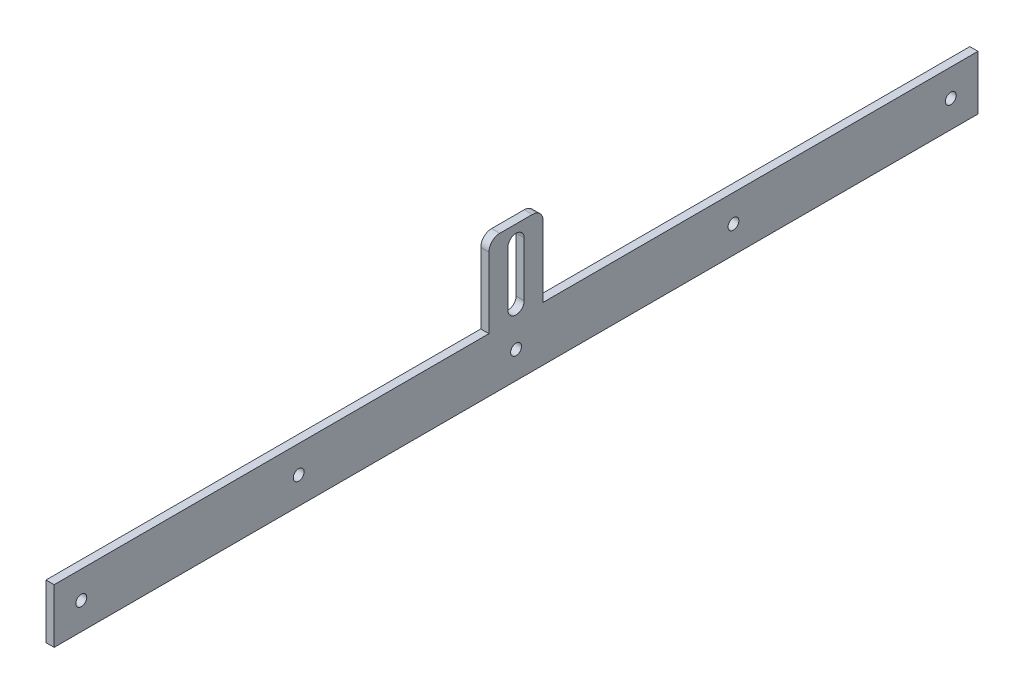
ISO-10303-21;
HEADER;
FILE_DESCRIPTION(('STEP AP214'),'2;1');
FILE_NAME('part.step','',(''),(''),'','','');
FILE_SCHEMA(('AUTOMOTIVE_DESIGN { 1 0 10303 214 1 1 1 1 }'));
ENDSEC;
DATA;
#1=APPLICATION_CONTEXT('core data for automotive mechanical design processes');
#2=APPLICATION_PROTOCOL_DEFINITION('international standard','automotive_design',2000,#1);
#3=PRODUCT_CONTEXT('',#1,'mechanical');
#4=PRODUCT('Part','Part','',(#3));
#5=PRODUCT_RELATED_PRODUCT_CATEGORY('part','',(#4));
#6=PRODUCT_DEFINITION_FORMATION('','',#4);
#7=PRODUCT_DEFINITION_CONTEXT('part definition',#1,'design');
#8=PRODUCT_DEFINITION('design','',#6,#7);
#9=PRODUCT_DEFINITION_SHAPE('','',#8);
#10=(LENGTH_UNIT() NAMED_UNIT(*) SI_UNIT(.MILLI.,.METRE.));
#11=(NAMED_UNIT(*) PLANE_ANGLE_UNIT() SI_UNIT($,.RADIAN.));
#12=(NAMED_UNIT(*) SI_UNIT($,.STERADIAN.) SOLID_ANGLE_UNIT());
#13=UNCERTAINTY_MEASURE_WITH_UNIT(LENGTH_MEASURE(1.E-05),#10,'distance_accuracy_value','');
#14=(GEOMETRIC_REPRESENTATION_CONTEXT(3) GLOBAL_UNCERTAINTY_ASSIGNED_CONTEXT((#13)) GLOBAL_UNIT_ASSIGNED_CONTEXT((#10,
#11,#12)) REPRESENTATION_CONTEXT('',''));
#15=CARTESIAN_POINT('',(0.,0.,0.));
#16=DIRECTION('',(0.,0.,1.));
#17=DIRECTION('',(1.,0.,0.));
#18=AXIS2_PLACEMENT_3D('',#15,#16,#17);
#19=CARTESIAN_POINT('',(3.,20.,0.));
#20=DIRECTION('',(0.,-1.,0.));
#21=DIRECTION('',(0.,0.,-1.));
#22=AXIS2_PLACEMENT_3D('',#19,#20,#21);
#23=PLANE('',#22);
#24=DIRECTION('',(1.,0.,0.));
#25=VECTOR('',#24,1.);
#26=CARTESIAN_POINT('',(0.,20.,-160.));
#27=LINE('',#26,#25);
#28=CARTESIAN_POINT('',(0.,20.,-160.));
#29=VERTEX_POINT('',#28);
#30=CARTESIAN_POINT('',(3.,20.,-160.));
#31=VERTEX_POINT('',#30);
#32=EDGE_CURVE('E214',#29,#31,#27,.T.);
#33=ORIENTED_EDGE('',*,*,#32,.F.);
#34=DIRECTION('',(0.,0.,1.));
#35=VECTOR('',#34,1.);
#36=CARTESIAN_POINT('',(0.,20.,0.));
#37=LINE('',#36,#35);
#38=CARTESIAN_POINT('',(0.,20.,0.));
#39=VERTEX_POINT('',#38);
#40=EDGE_CURVE('E82',#29,#39,#37,.T.);
#41=ORIENTED_EDGE('',*,*,#40,.T.);
#42=DIRECTION('',(-1.,0.,0.));
#43=VECTOR('',#42,1.);
#44=CARTESIAN_POINT('',(3.,20.,0.));
#45=LINE('',#44,#43);
#46=CARTESIAN_POINT('',(3.,20.,0.));
#47=VERTEX_POINT('',#46);
#48=EDGE_CURVE('E278',#47,#39,#45,.T.);
#49=ORIENTED_EDGE('',*,*,#48,.F.);
#50=DIRECTION('',(0.,0.,1.));
#51=VECTOR('',#50,1.);
#52=CARTESIAN_POINT('',(3.,20.,0.));
#53=LINE('',#52,#51);
#54=EDGE_CURVE('E60',#31,#47,#53,.T.);
#55=ORIENTED_EDGE('',*,*,#54,.F.);
#56=EDGE_LOOP('',(#33,#41,#49,#55));
#57=FACE_BOUND('',#56,.T.);
#58=ADVANCED_FACE('F34',(#57),#23,.F.);
#59=CARTESIAN_POINT('',(3.,0.,0.));
#60=DIRECTION('',(0.,0.,-1.));
#61=DIRECTION('',(-1.,0.,0.));
#62=AXIS2_PLACEMENT_3D('',#59,#60,#61);
#63=PLANE('',#62);
#64=DIRECTION('',(0.,-1.,0.));
#65=VECTOR('',#64,1.);
#66=CARTESIAN_POINT('',(0.,0.,0.));
#67=LINE('',#66,#65);
#68=CARTESIAN_POINT('',(0.,0.,0.));
#69=VERTEX_POINT('',#68);
#70=EDGE_CURVE('E270',#39,#69,#67,.T.);
#71=ORIENTED_EDGE('',*,*,#70,.T.);
#72=DIRECTION('',(-1.,0.,0.));
#73=VECTOR('',#72,1.);
#74=CARTESIAN_POINT('',(3.,0.,0.));
#75=LINE('',#74,#73);
#76=CARTESIAN_POINT('',(3.,0.,0.));
#77=VERTEX_POINT('',#76);
#78=EDGE_CURVE('E11',#77,#69,#75,.T.);
#79=ORIENTED_EDGE('',*,*,#78,.F.);
#80=DIRECTION('',(0.,-1.,0.));
#81=VECTOR('',#80,1.);
#82=CARTESIAN_POINT('',(3.,0.,0.));
#83=LINE('',#82,#81);
#84=EDGE_CURVE('E262',#47,#77,#83,.T.);
#85=ORIENTED_EDGE('',*,*,#84,.F.);
#86=ORIENTED_EDGE('',*,*,#48,.T.);
#87=EDGE_LOOP('',(#71,#79,#85,#86));
#88=FACE_BOUND('',#87,.T.);
#89=ADVANCED_FACE('F36',(#88),#63,.F.);
#90=CARTESIAN_POINT('',(3.,0.,0.));
#91=DIRECTION('',(0.,1.,0.));
#92=DIRECTION('',(0.,0.,1.));
#93=AXIS2_PLACEMENT_3D('',#90,#91,#92);
#94=PLANE('',#93);
#95=DIRECTION('',(0.,0.,-1.));
#96=VECTOR('',#95,1.);
#97=CARTESIAN_POINT('',(0.,0.,0.));
#98=LINE('',#97,#96);
#99=CARTESIAN_POINT('',(0.,0.,-340.));
#100=VERTEX_POINT('',#99);
#101=EDGE_CURVE('E322',#69,#100,#98,.T.);
#102=ORIENTED_EDGE('',*,*,#101,.T.);
#103=DIRECTION('',(-1.,0.,0.));
#104=VECTOR('',#103,1.);
#105=CARTESIAN_POINT('',(3.,0.,-340.));
#106=LINE('',#105,#104);
#107=CARTESIAN_POINT('',(3.,0.,-340.));
#108=VERTEX_POINT('',#107);
#109=EDGE_CURVE('E43',#108,#100,#106,.T.);
#110=ORIENTED_EDGE('',*,*,#109,.F.);
#111=DIRECTION('',(0.,0.,-1.));
#112=VECTOR('',#111,1.);
#113=CARTESIAN_POINT('',(3.,0.,0.));
#114=LINE('',#113,#112);
#115=EDGE_CURVE('E89',#77,#108,#114,.T.);
#116=ORIENTED_EDGE('',*,*,#115,.F.);
#117=ORIENTED_EDGE('',*,*,#78,.T.);
#118=EDGE_LOOP('',(#102,#110,#116,#117));
#119=FACE_BOUND('',#118,.T.);
#120=ADVANCED_FACE('F340',(#119),#94,.F.);
#121=CARTESIAN_POINT('',(3.,0.,-340.));
#122=DIRECTION('',(0.,0.,1.));
#123=DIRECTION('',(1.,0.,0.));
#124=AXIS2_PLACEMENT_3D('',#121,#122,#123);
#125=PLANE('',#124);
#126=DIRECTION('',(0.,1.,0.));
#127=VECTOR('',#126,1.);
#128=CARTESIAN_POINT('',(0.,0.,-340.));
#129=LINE('',#128,#127);
#130=CARTESIAN_POINT('',(0.,20.,-340.));
#131=VERTEX_POINT('',#130);
#132=EDGE_CURVE('E281',#100,#131,#129,.T.);
#133=ORIENTED_EDGE('',*,*,#132,.T.);
#134=DIRECTION('',(-1.,0.,0.));
#135=VECTOR('',#134,1.);
#136=CARTESIAN_POINT('',(3.,20.,-340.));
#137=LINE('',#136,#135);
#138=CARTESIAN_POINT('',(3.,20.,-340.));
#139=VERTEX_POINT('',#138);
#140=EDGE_CURVE('E288',#139,#131,#137,.T.);
#141=ORIENTED_EDGE('',*,*,#140,.F.);
#142=DIRECTION('',(0.,1.,0.));
#143=VECTOR('',#142,1.);
#144=CARTESIAN_POINT('',(3.,0.,-340.));
#145=LINE('',#144,#143);
#146=EDGE_CURVE('E266',#108,#139,#145,.T.);
#147=ORIENTED_EDGE('',*,*,#146,.F.);
#148=ORIENTED_EDGE('',*,*,#109,.T.);
#149=EDGE_LOOP('',(#133,#141,#147,#148));
#150=FACE_BOUND('',#149,.T.);
#151=ADVANCED_FACE('F327',(#150),#125,.F.);
#152=CARTESIAN_POINT('',(0.,20.,-180.));
#153=VERTEX_POINT('',#152);
#154=EDGE_CURVE('E264',#131,#153,#37,.T.);
#155=ORIENTED_EDGE('',*,*,#154,.T.);
#156=DIRECTION('',(1.,0.,0.));
#157=VECTOR('',#156,1.);
#158=CARTESIAN_POINT('',(0.,20.,-180.));
#159=LINE('',#158,#157);
#160=CARTESIAN_POINT('',(3.,20.,-180.));
#161=VERTEX_POINT('',#160);
#162=EDGE_CURVE('E210',#153,#161,#159,.T.);
#163=ORIENTED_EDGE('',*,*,#162,.T.);
#164=EDGE_CURVE('E275',#139,#161,#53,.T.);
#165=ORIENTED_EDGE('',*,*,#164,.F.);
#166=ORIENTED_EDGE('',*,*,#140,.T.);
#167=EDGE_LOOP('',(#155,#163,#165,#166));
#168=FACE_BOUND('',#167,.T.);
#169=ADVANCED_FACE('F333',(#168),#23,.F.);
#170=CARTESIAN_POINT('',(3.,0.,0.));
#171=DIRECTION('',(-1.,0.,0.));
#172=DIRECTION('',(0.,0.,1.));
#173=AXIS2_PLACEMENT_3D('',#170,#171,#172);
#174=PLANE('',#173);
#175=CARTESIAN_POINT('',(3.,10.,-330.));
#176=DIRECTION('',(1.,0.,0.));
#177=DIRECTION('',(0.,0.,-1.));
#178=AXIS2_PLACEMENT_3D('',#175,#176,#177);
#179=CIRCLE('',#178,2.);
#180=CARTESIAN_POINT('',(3.,10.,-332.));
#181=VERTEX_POINT('',#180);
#182=EDGE_CURVE('E213',#181,#181,#179,.T.);
#183=ORIENTED_EDGE('',*,*,#182,.F.);
#184=EDGE_LOOP('',(#183));
#185=FACE_BOUND('',#184,.T.);
#186=CARTESIAN_POINT('',(3.,10.,-250.));
#187=DIRECTION('',(1.,0.,0.));
#188=DIRECTION('',(0.,0.,-1.));
#189=AXIS2_PLACEMENT_3D('',#186,#187,#188);
#190=CIRCLE('',#189,2.);
#191=CARTESIAN_POINT('',(3.,10.,-252.));
#192=VERTEX_POINT('',#191);
#193=EDGE_CURVE('E246',#192,#192,#190,.T.);
#194=ORIENTED_EDGE('',*,*,#193,.F.);
#195=EDGE_LOOP('',(#194));
#196=FACE_BOUND('',#195,.T.);
#197=CARTESIAN_POINT('',(3.,10.,-170.));
#198=DIRECTION('',(1.,0.,0.));
#199=DIRECTION('',(0.,0.,-1.));
#200=AXIS2_PLACEMENT_3D('',#197,#198,#199);
#201=CIRCLE('',#200,2.);
#202=CARTESIAN_POINT('',(3.,10.,-172.));
#203=VERTEX_POINT('',#202);
#204=EDGE_CURVE('E250',#203,#203,#201,.T.);
#205=ORIENTED_EDGE('',*,*,#204,.F.);
#206=EDGE_LOOP('',(#205));
#207=FACE_BOUND('',#206,.T.);
#208=CARTESIAN_POINT('',(3.,10.,-90.));
#209=DIRECTION('',(1.,0.,0.));
#210=DIRECTION('',(0.,0.,-1.));
#211=AXIS2_PLACEMENT_3D('',#208,#209,#210);
#212=CIRCLE('',#211,2.00000000000001);
#213=CARTESIAN_POINT('',(3.,10.,-92.));
#214=VERTEX_POINT('',#213);
#215=EDGE_CURVE('E254',#214,#214,#212,.T.);
#216=ORIENTED_EDGE('',*,*,#215,.F.);
#217=EDGE_LOOP('',(#216));
#218=FACE_BOUND('',#217,.T.);
#219=CARTESIAN_POINT('',(3.,10.,-10.));
#220=DIRECTION('',(1.,0.,0.));
#221=DIRECTION('',(0.,0.,-1.));
#222=AXIS2_PLACEMENT_3D('',#219,#220,#221);
#223=CIRCLE('',#222,2.);
#224=CARTESIAN_POINT('',(3.,10.,-12.));
#225=VERTEX_POINT('',#224);
#226=EDGE_CURVE('E258',#225,#225,#223,.T.);
#227=ORIENTED_EDGE('',*,*,#226,.F.);
#228=EDGE_LOOP('',(#227));
#229=FACE_BOUND('',#228,.T.);
#230=ORIENTED_EDGE('',*,*,#84,.T.);
#231=ORIENTED_EDGE('',*,*,#115,.T.);
#232=ORIENTED_EDGE('',*,*,#146,.T.);
#233=ORIENTED_EDGE('',*,*,#164,.T.);
#234=DIRECTION('',(0.,1.,0.));
#235=VECTOR('',#234,1.);
#236=CARTESIAN_POINT('',(3.,1.92153985031277E-13,-180.));
#237=LINE('',#236,#235);
#238=CARTESIAN_POINT('',(3.,46.,-180.));
#239=VERTEX_POINT('',#238);
#240=EDGE_CURVE('E51',#161,#239,#237,.T.);
#241=ORIENTED_EDGE('',*,*,#240,.T.);
#242=CARTESIAN_POINT('',(3.,46.,-176.));
#243=DIRECTION('',(1.,0.,0.));
#244=DIRECTION('',(0.,0.,-1.));
#245=AXIS2_PLACEMENT_3D('',#242,#243,#244);
#246=CIRCLE('',#245,4.);
#247=CARTESIAN_POINT('',(3.,50.,-176.));
#248=VERTEX_POINT('',#247);
#249=EDGE_CURVE('E197',#239,#248,#246,.T.);
#250=ORIENTED_EDGE('',*,*,#249,.T.);
#251=DIRECTION('',(0.,0.,-1.));
#252=VECTOR('',#251,1.);
#253=CARTESIAN_POINT('',(3.,50.,0.));
#254=LINE('',#253,#252);
#255=CARTESIAN_POINT('',(3.,50.,-164.));
#256=VERTEX_POINT('',#255);
#257=EDGE_CURVE('E200',#256,#248,#254,.T.);
#258=ORIENTED_EDGE('',*,*,#257,.F.);
#259=CARTESIAN_POINT('',(3.,46.,-164.));
#260=DIRECTION('',(1.,0.,0.));
#261=DIRECTION('',(0.,0.,-1.));
#262=AXIS2_PLACEMENT_3D('',#259,#260,#261);
#263=CIRCLE('',#262,4.);
#264=CARTESIAN_POINT('',(3.,46.,-160.));
#265=VERTEX_POINT('',#264);
#266=EDGE_CURVE('E175',#265,#256,#263,.F.);
#267=ORIENTED_EDGE('',*,*,#266,.F.);
#268=DIRECTION('',(0.,1.,0.));
#269=VECTOR('',#268,1.);
#270=CARTESIAN_POINT('',(3.,0.,-160.));
#271=LINE('',#270,#269);
#272=EDGE_CURVE('E172',#31,#265,#271,.T.);
#273=ORIENTED_EDGE('',*,*,#272,.F.);
#274=ORIENTED_EDGE('',*,*,#54,.T.);
#275=EDGE_LOOP('',(#230,#231,#232,#233,#241,#250,#258,#267,#273,#274));
#276=FACE_BOUND('',#275,.T.);
#277=CARTESIAN_POINT('',(3.,24.,-170.));
#278=DIRECTION('',(1.,0.,0.));
#279=DIRECTION('',(0.,0.,-1.));
#280=AXIS2_PLACEMENT_3D('',#277,#278,#279);
#281=CIRCLE('',#280,3.);
#282=CARTESIAN_POINT('',(3.,24.,-167.));
#283=VERTEX_POINT('',#282);
#284=CARTESIAN_POINT('',(3.,24.,-173.));
#285=VERTEX_POINT('',#284);
#286=EDGE_CURVE('E189',#283,#285,#281,.T.);
#287=ORIENTED_EDGE('',*,*,#286,.F.);
#288=DIRECTION('',(0.,-1.,0.));
#289=VECTOR('',#288,1.);
#290=CARTESIAN_POINT('',(3.,0.,-167.));
#291=LINE('',#290,#289);
#292=CARTESIAN_POINT('',(3.,44.,-167.));
#293=VERTEX_POINT('',#292);
#294=EDGE_CURVE('E162',#293,#283,#291,.T.);
#295=ORIENTED_EDGE('',*,*,#294,.F.);
#296=CARTESIAN_POINT('',(3.,44.,-170.));
#297=DIRECTION('',(1.,0.,0.));
#298=DIRECTION('',(0.,0.,-1.));
#299=AXIS2_PLACEMENT_3D('',#296,#297,#298);
#300=CIRCLE('',#299,3.);
#301=CARTESIAN_POINT('',(3.,44.,-173.));
#302=VERTEX_POINT('',#301);
#303=EDGE_CURVE('E192',#302,#293,#300,.T.);
#304=ORIENTED_EDGE('',*,*,#303,.F.);
#305=DIRECTION('',(0.,-1.,0.));
#306=VECTOR('',#305,1.);
#307=CARTESIAN_POINT('',(3.,0.,-173.));
#308=LINE('',#307,#306);
#309=EDGE_CURVE('E194',#302,#285,#308,.T.);
#310=ORIENTED_EDGE('',*,*,#309,.T.);
#311=EDGE_LOOP('',(#287,#295,#304,#310));
#312=FACE_BOUND('',#311,.T.);
#313=ADVANCED_FACE('F309',(#185,#196,#207,#218,#229,#276,#312),#174,.F.);
#314=CARTESIAN_POINT('',(0.,0.,0.));
#315=DIRECTION('',(-1.,0.,0.));
#316=DIRECTION('',(0.,0.,1.));
#317=AXIS2_PLACEMENT_3D('',#314,#315,#316);
#318=PLANE('',#317);
#319=CARTESIAN_POINT('',(0.,10.,-330.));
#320=DIRECTION('',(-1.,0.,0.));
#321=DIRECTION('',(0.,0.,1.));
#322=AXIS2_PLACEMENT_3D('',#319,#320,#321);
#323=CIRCLE('',#322,2.);
#324=CARTESIAN_POINT('',(0.,10.,-328.));
#325=VERTEX_POINT('',#324);
#326=EDGE_CURVE('E245',#325,#325,#323,.T.);
#327=ORIENTED_EDGE('',*,*,#326,.F.);
#328=EDGE_LOOP('',(#327));
#329=FACE_BOUND('',#328,.T.);
#330=CARTESIAN_POINT('',(0.,10.,-250.));
#331=DIRECTION('',(-1.,0.,0.));
#332=DIRECTION('',(0.,0.,1.));
#333=AXIS2_PLACEMENT_3D('',#330,#331,#332);
#334=CIRCLE('',#333,2.);
#335=CARTESIAN_POINT('',(0.,10.,-248.));
#336=VERTEX_POINT('',#335);
#337=EDGE_CURVE('E249',#336,#336,#334,.T.);
#338=ORIENTED_EDGE('',*,*,#337,.F.);
#339=EDGE_LOOP('',(#338));
#340=FACE_BOUND('',#339,.T.);
#341=CARTESIAN_POINT('',(0.,10.,-170.));
#342=DIRECTION('',(-1.,0.,0.));
#343=DIRECTION('',(0.,0.,1.));
#344=AXIS2_PLACEMENT_3D('',#341,#342,#343);
#345=CIRCLE('',#344,2.);
#346=CARTESIAN_POINT('',(0.,10.,-168.));
#347=VERTEX_POINT('',#346);
#348=EDGE_CURVE('E253',#347,#347,#345,.T.);
#349=ORIENTED_EDGE('',*,*,#348,.F.);
#350=EDGE_LOOP('',(#349));
#351=FACE_BOUND('',#350,.T.);
#352=CARTESIAN_POINT('',(0.,10.,-90.));
#353=DIRECTION('',(-1.,0.,0.));
#354=DIRECTION('',(0.,0.,1.));
#355=AXIS2_PLACEMENT_3D('',#352,#353,#354);
#356=CIRCLE('',#355,2.00000000000001);
#357=CARTESIAN_POINT('',(0.,10.,-88.));
#358=VERTEX_POINT('',#357);
#359=EDGE_CURVE('E257',#358,#358,#356,.T.);
#360=ORIENTED_EDGE('',*,*,#359,.F.);
#361=EDGE_LOOP('',(#360));
#362=FACE_BOUND('',#361,.T.);
#363=CARTESIAN_POINT('',(0.,10.,-10.));
#364=DIRECTION('',(-1.,0.,0.));
#365=DIRECTION('',(0.,0.,1.));
#366=AXIS2_PLACEMENT_3D('',#363,#364,#365);
#367=CIRCLE('',#366,2.);
#368=CARTESIAN_POINT('',(0.,10.,-8.));
#369=VERTEX_POINT('',#368);
#370=EDGE_CURVE('E261',#369,#369,#367,.T.);
#371=ORIENTED_EDGE('',*,*,#370,.F.);
#372=EDGE_LOOP('',(#371));
#373=FACE_BOUND('',#372,.T.);
#374=ORIENTED_EDGE('',*,*,#70,.F.);
#375=ORIENTED_EDGE('',*,*,#40,.F.);
#376=DIRECTION('',(0.,1.,0.));
#377=VECTOR('',#376,1.);
#378=CARTESIAN_POINT('',(0.,0.,-160.));
#379=LINE('',#378,#377);
#380=CARTESIAN_POINT('',(0.,46.,-160.));
#381=VERTEX_POINT('',#380);
#382=EDGE_CURVE('E167',#29,#381,#379,.T.);
#383=ORIENTED_EDGE('',*,*,#382,.T.);
#384=CARTESIAN_POINT('',(0.,46.,-164.));
#385=DIRECTION('',(1.,0.,0.));
#386=DIRECTION('',(0.,0.,-1.));
#387=AXIS2_PLACEMENT_3D('',#384,#385,#386);
#388=CIRCLE('',#387,4.);
#389=CARTESIAN_POINT('',(0.,50.,-164.));
#390=VERTEX_POINT('',#389);
#391=EDGE_CURVE('E186',#381,#390,#388,.F.);
#392=ORIENTED_EDGE('',*,*,#391,.T.);
#393=DIRECTION('',(0.,0.,-1.));
#394=VECTOR('',#393,1.);
#395=CARTESIAN_POINT('',(0.,50.,0.));
#396=LINE('',#395,#394);
#397=CARTESIAN_POINT('',(0.,50.,-176.));
#398=VERTEX_POINT('',#397);
#399=EDGE_CURVE('E184',#390,#398,#396,.T.);
#400=ORIENTED_EDGE('',*,*,#399,.T.);
#401=CARTESIAN_POINT('',(0.,46.,-176.));
#402=DIRECTION('',(1.,0.,0.));
#403=DIRECTION('',(0.,0.,-1.));
#404=AXIS2_PLACEMENT_3D('',#401,#402,#403);
#405=CIRCLE('',#404,4.);
#406=CARTESIAN_POINT('',(0.,46.,-180.));
#407=VERTEX_POINT('',#406);
#408=EDGE_CURVE('E181',#407,#398,#405,.T.);
#409=ORIENTED_EDGE('',*,*,#408,.F.);
#410=DIRECTION('',(0.,1.,0.));
#411=VECTOR('',#410,1.);
#412=CARTESIAN_POINT('',(0.,1.92153985031277E-13,-180.));
#413=LINE('',#412,#411);
#414=EDGE_CURVE('E180',#153,#407,#413,.T.);
#415=ORIENTED_EDGE('',*,*,#414,.F.);
#416=ORIENTED_EDGE('',*,*,#154,.F.);
#417=ORIENTED_EDGE('',*,*,#132,.F.);
#418=ORIENTED_EDGE('',*,*,#101,.F.);
#419=EDGE_LOOP('',(#374,#375,#383,#392,#400,#409,#415,#416,#417,#418));
#420=FACE_BOUND('',#419,.T.);
#421=CARTESIAN_POINT('',(0.,24.,-170.));
#422=DIRECTION('',(1.,0.,0.));
#423=DIRECTION('',(0.,0.,-1.));
#424=AXIS2_PLACEMENT_3D('',#421,#422,#423);
#425=CIRCLE('',#424,3.);
#426=CARTESIAN_POINT('',(0.,24.,-167.));
#427=VERTEX_POINT('',#426);
#428=CARTESIAN_POINT('',(0.,24.,-173.));
#429=VERTEX_POINT('',#428);
#430=EDGE_CURVE('E150',#427,#429,#425,.T.);
#431=ORIENTED_EDGE('',*,*,#430,.T.);
#432=DIRECTION('',(0.,-1.,0.));
#433=VECTOR('',#432,1.);
#434=CARTESIAN_POINT('',(0.,0.,-173.));
#435=LINE('',#434,#433);
#436=CARTESIAN_POINT('',(0.,44.,-173.));
#437=VERTEX_POINT('',#436);
#438=EDGE_CURVE('E178',#437,#429,#435,.T.);
#439=ORIENTED_EDGE('',*,*,#438,.F.);
#440=CARTESIAN_POINT('',(0.,44.,-170.));
#441=DIRECTION('',(1.,0.,0.));
#442=DIRECTION('',(0.,0.,-1.));
#443=AXIS2_PLACEMENT_3D('',#440,#441,#442);
#444=CIRCLE('',#443,3.);
#445=CARTESIAN_POINT('',(0.,44.,-167.));
#446=VERTEX_POINT('',#445);
#447=EDGE_CURVE('E153',#437,#446,#444,.T.);
#448=ORIENTED_EDGE('',*,*,#447,.T.);
#449=DIRECTION('',(0.,-1.,0.));
#450=VECTOR('',#449,1.);
#451=CARTESIAN_POINT('',(0.,0.,-167.));
#452=LINE('',#451,#450);
#453=EDGE_CURVE('E145',#446,#427,#452,.T.);
#454=ORIENTED_EDGE('',*,*,#453,.T.);
#455=EDGE_LOOP('',(#431,#439,#448,#454));
#456=FACE_BOUND('',#455,.T.);
#457=ADVANCED_FACE('F147',(#329,#340,#351,#362,#373,#420,#456),#318,.T.);
#458=CARTESIAN_POINT('',(-7.,10.,-10.));
#459=DIRECTION('',(1.,0.,0.));
#460=DIRECTION('',(0.,0.,-1.));
#461=AXIS2_PLACEMENT_3D('',#458,#459,#460);
#462=CYLINDRICAL_SURFACE('',#461,2.);
#463=ORIENTED_EDGE('',*,*,#370,.T.);
#464=EDGE_LOOP('',(#463));
#465=FACE_BOUND('',#464,.T.);
#466=ORIENTED_EDGE('',*,*,#226,.T.);
#467=EDGE_LOOP('',(#466));
#468=FACE_BOUND('',#467,.T.);
#469=ADVANCED_FACE('F308',(#465,#468),#462,.F.);
#470=CARTESIAN_POINT('',(-7.,10.,-90.));
#471=DIRECTION('',(1.,0.,0.));
#472=DIRECTION('',(0.,0.,-1.));
#473=AXIS2_PLACEMENT_3D('',#470,#471,#472);
#474=CYLINDRICAL_SURFACE('',#473,2.00000000000001);
#475=ORIENTED_EDGE('',*,*,#359,.T.);
#476=EDGE_LOOP('',(#475));
#477=FACE_BOUND('',#476,.T.);
#478=ORIENTED_EDGE('',*,*,#215,.T.);
#479=EDGE_LOOP('',(#478));
#480=FACE_BOUND('',#479,.T.);
#481=ADVANCED_FACE('F364',(#477,#480),#474,.F.);
#482=CARTESIAN_POINT('',(-7.,10.,-170.));
#483=DIRECTION('',(1.,0.,0.));
#484=DIRECTION('',(0.,0.,-1.));
#485=AXIS2_PLACEMENT_3D('',#482,#483,#484);
#486=CYLINDRICAL_SURFACE('',#485,2.);
#487=ORIENTED_EDGE('',*,*,#348,.T.);
#488=EDGE_LOOP('',(#487));
#489=FACE_BOUND('',#488,.T.);
#490=ORIENTED_EDGE('',*,*,#204,.T.);
#491=EDGE_LOOP('',(#490));
#492=FACE_BOUND('',#491,.T.);
#493=ADVANCED_FACE('F368',(#489,#492),#486,.F.);
#494=CARTESIAN_POINT('',(-7.,10.,-250.));
#495=DIRECTION('',(1.,0.,0.));
#496=DIRECTION('',(0.,0.,-1.));
#497=AXIS2_PLACEMENT_3D('',#494,#495,#496);
#498=CYLINDRICAL_SURFACE('',#497,2.);
#499=ORIENTED_EDGE('',*,*,#337,.T.);
#500=EDGE_LOOP('',(#499));
#501=FACE_BOUND('',#500,.T.);
#502=ORIENTED_EDGE('',*,*,#193,.T.);
#503=EDGE_LOOP('',(#502));
#504=FACE_BOUND('',#503,.T.);
#505=ADVANCED_FACE('F372',(#501,#504),#498,.F.);
#506=CARTESIAN_POINT('',(-7.,10.,-330.));
#507=DIRECTION('',(1.,0.,0.));
#508=DIRECTION('',(0.,0.,-1.));
#509=AXIS2_PLACEMENT_3D('',#506,#507,#508);
#510=CYLINDRICAL_SURFACE('',#509,2.);
#511=ORIENTED_EDGE('',*,*,#326,.T.);
#512=EDGE_LOOP('',(#511));
#513=FACE_BOUND('',#512,.T.);
#514=ORIENTED_EDGE('',*,*,#182,.T.);
#515=EDGE_LOOP('',(#514));
#516=FACE_BOUND('',#515,.T.);
#517=ADVANCED_FACE('F303',(#513,#516),#510,.F.);
#518=CARTESIAN_POINT('',(0.,1.92153985031277E-13,-180.));
#519=DIRECTION('',(0.,0.,-1.));
#520=DIRECTION('',(0.,1.,0.));
#521=AXIS2_PLACEMENT_3D('',#518,#519,#520);
#522=PLANE('',#521);
#523=ORIENTED_EDGE('',*,*,#240,.F.);
#524=ORIENTED_EDGE('',*,*,#162,.F.);
#525=ORIENTED_EDGE('',*,*,#414,.T.);
#526=DIRECTION('',(1.,0.,0.));
#527=VECTOR('',#526,1.);
#528=CARTESIAN_POINT('',(0.,46.,-180.));
#529=LINE('',#528,#527);
#530=EDGE_CURVE('E237',#407,#239,#529,.T.);
#531=ORIENTED_EDGE('',*,*,#530,.T.);
#532=EDGE_LOOP('',(#523,#524,#525,#531));
#533=FACE_BOUND('',#532,.T.);
#534=ADVANCED_FACE('F336',(#533),#522,.T.);
#535=CARTESIAN_POINT('',(0.,0.,-160.));
#536=DIRECTION('',(0.,0.,-1.));
#537=DIRECTION('',(-1.,0.,0.));
#538=AXIS2_PLACEMENT_3D('',#535,#536,#537);
#539=PLANE('',#538);
#540=ORIENTED_EDGE('',*,*,#272,.T.);
#541=DIRECTION('',(1.,0.,0.));
#542=VECTOR('',#541,1.);
#543=CARTESIAN_POINT('',(0.,46.,-160.));
#544=LINE('',#543,#542);
#545=EDGE_CURVE('E226',#381,#265,#544,.T.);
#546=ORIENTED_EDGE('',*,*,#545,.F.);
#547=ORIENTED_EDGE('',*,*,#382,.F.);
#548=ORIENTED_EDGE('',*,*,#32,.T.);
#549=EDGE_LOOP('',(#540,#546,#547,#548));
#550=FACE_BOUND('',#549,.T.);
#551=ADVANCED_FACE('F395',(#550),#539,.F.);
#552=CARTESIAN_POINT('',(0.,46.,-164.));
#553=DIRECTION('',(1.,0.,0.));
#554=DIRECTION('',(0.,0.,-1.));
#555=AXIS2_PLACEMENT_3D('',#552,#553,#554);
#556=CYLINDRICAL_SURFACE('',#555,4.);
#557=ORIENTED_EDGE('',*,*,#266,.T.);
#558=DIRECTION('',(1.,0.,0.));
#559=VECTOR('',#558,1.);
#560=CARTESIAN_POINT('',(0.,50.,-164.));
#561=LINE('',#560,#559);
#562=EDGE_CURVE('E229',#390,#256,#561,.T.);
#563=ORIENTED_EDGE('',*,*,#562,.F.);
#564=ORIENTED_EDGE('',*,*,#391,.F.);
#565=ORIENTED_EDGE('',*,*,#545,.T.);
#566=EDGE_LOOP('',(#557,#563,#564,#565));
#567=FACE_BOUND('',#566,.T.);
#568=ADVANCED_FACE('F401',(#567),#556,.T.);
#569=CARTESIAN_POINT('',(0.,50.,0.));
#570=DIRECTION('',(0.,-1.,0.));
#571=DIRECTION('',(0.,0.,-1.));
#572=AXIS2_PLACEMENT_3D('',#569,#570,#571);
#573=PLANE('',#572);
#574=ORIENTED_EDGE('',*,*,#257,.T.);
#575=DIRECTION('',(1.,0.,0.));
#576=VECTOR('',#575,1.);
#577=CARTESIAN_POINT('',(0.,50.,-176.));
#578=LINE('',#577,#576);
#579=EDGE_CURVE('E233',#398,#248,#578,.T.);
#580=ORIENTED_EDGE('',*,*,#579,.F.);
#581=ORIENTED_EDGE('',*,*,#399,.F.);
#582=ORIENTED_EDGE('',*,*,#562,.T.);
#583=EDGE_LOOP('',(#574,#580,#581,#582));
#584=FACE_BOUND('',#583,.T.);
#585=ADVANCED_FACE('F382',(#584),#573,.F.);
#586=CARTESIAN_POINT('',(0.,24.,-170.));
#587=DIRECTION('',(1.,0.,0.));
#588=DIRECTION('',(0.,0.,-1.));
#589=AXIS2_PLACEMENT_3D('',#586,#587,#588);
#590=CYLINDRICAL_SURFACE('',#589,3.);
#591=ORIENTED_EDGE('',*,*,#286,.T.);
#592=DIRECTION('',(1.,0.,0.));
#593=VECTOR('',#592,1.);
#594=CARTESIAN_POINT('',(0.,24.,-173.));
#595=LINE('',#594,#593);
#596=EDGE_CURVE('E170',#429,#285,#595,.T.);
#597=ORIENTED_EDGE('',*,*,#596,.F.);
#598=ORIENTED_EDGE('',*,*,#430,.F.);
#599=DIRECTION('',(1.,0.,0.));
#600=VECTOR('',#599,1.);
#601=CARTESIAN_POINT('',(0.,24.,-167.));
#602=LINE('',#601,#600);
#603=EDGE_CURVE('E159',#427,#283,#602,.T.);
#604=ORIENTED_EDGE('',*,*,#603,.T.);
#605=EDGE_LOOP('',(#591,#597,#598,#604));
#606=FACE_BOUND('',#605,.T.);
#607=ADVANCED_FACE('F169',(#606),#590,.F.);
#608=CARTESIAN_POINT('',(0.,0.,-173.));
#609=DIRECTION('',(0.,0.,1.));
#610=DIRECTION('',(1.,0.,0.));
#611=AXIS2_PLACEMENT_3D('',#608,#609,#610);
#612=PLANE('',#611);
#613=ORIENTED_EDGE('',*,*,#309,.F.);
#614=DIRECTION('',(1.,0.,0.));
#615=VECTOR('',#614,1.);
#616=CARTESIAN_POINT('',(0.,44.,-173.));
#617=LINE('',#616,#615);
#618=EDGE_CURVE('E240',#437,#302,#617,.T.);
#619=ORIENTED_EDGE('',*,*,#618,.F.);
#620=ORIENTED_EDGE('',*,*,#438,.T.);
#621=ORIENTED_EDGE('',*,*,#596,.T.);
#622=EDGE_LOOP('',(#613,#619,#620,#621));
#623=FACE_BOUND('',#622,.T.);
#624=ADVANCED_FACE('F381',(#623),#612,.T.);
#625=CARTESIAN_POINT('',(0.,44.,-170.));
#626=DIRECTION('',(1.,0.,0.));
#627=DIRECTION('',(0.,0.,-1.));
#628=AXIS2_PLACEMENT_3D('',#625,#626,#627);
#629=CYLINDRICAL_SURFACE('',#628,3.);
#630=ORIENTED_EDGE('',*,*,#303,.T.);
#631=DIRECTION('',(1.,0.,0.));
#632=VECTOR('',#631,1.);
#633=CARTESIAN_POINT('',(0.,44.,-167.));
#634=LINE('',#633,#632);
#635=EDGE_CURVE('E166',#446,#293,#634,.T.);
#636=ORIENTED_EDGE('',*,*,#635,.F.);
#637=ORIENTED_EDGE('',*,*,#447,.F.);
#638=ORIENTED_EDGE('',*,*,#618,.T.);
#639=EDGE_LOOP('',(#630,#636,#637,#638));
#640=FACE_BOUND('',#639,.T.);
#641=ADVANCED_FACE('F386',(#640),#629,.F.);
#642=CARTESIAN_POINT('',(0.,0.,-167.));
#643=DIRECTION('',(0.,0.,1.));
#644=DIRECTION('',(1.,0.,0.));
#645=AXIS2_PLACEMENT_3D('',#642,#643,#644);
#646=PLANE('',#645);
#647=ORIENTED_EDGE('',*,*,#294,.T.);
#648=ORIENTED_EDGE('',*,*,#603,.F.);
#649=ORIENTED_EDGE('',*,*,#453,.F.);
#650=ORIENTED_EDGE('',*,*,#635,.T.);
#651=EDGE_LOOP('',(#647,#648,#649,#650));
#652=FACE_BOUND('',#651,.T.);
#653=ADVANCED_FACE('F160',(#652),#646,.F.);
#654=CARTESIAN_POINT('',(0.,46.,-176.));
#655=DIRECTION('',(1.,0.,0.));
#656=DIRECTION('',(0.,0.,-1.));
#657=AXIS2_PLACEMENT_3D('',#654,#655,#656);
#658=CYLINDRICAL_SURFACE('',#657,4.);
#659=ORIENTED_EDGE('',*,*,#249,.F.);
#660=ORIENTED_EDGE('',*,*,#530,.F.);
#661=ORIENTED_EDGE('',*,*,#408,.T.);
#662=ORIENTED_EDGE('',*,*,#579,.T.);
#663=EDGE_LOOP('',(#659,#660,#661,#662));
#664=FACE_BOUND('',#663,.T.);
#665=ADVANCED_FACE('F385',(#664),#658,.T.);
#666=CLOSED_SHELL('',(#58,#89,#120,#151,#169,#313,#457,#469,#481,#493,#505,#517,#534,#551,#568,
#585,#607,#624,#641,#653,#665));
#667=MANIFOLD_SOLID_BREP('B2',#666);
#668=ADVANCED_BREP_SHAPE_REPRESENTATION('',(#18,#667),#14);
#669=SHAPE_DEFINITION_REPRESENTATION(#9,#668);
ENDSEC;
END-ISO-10303-21;
